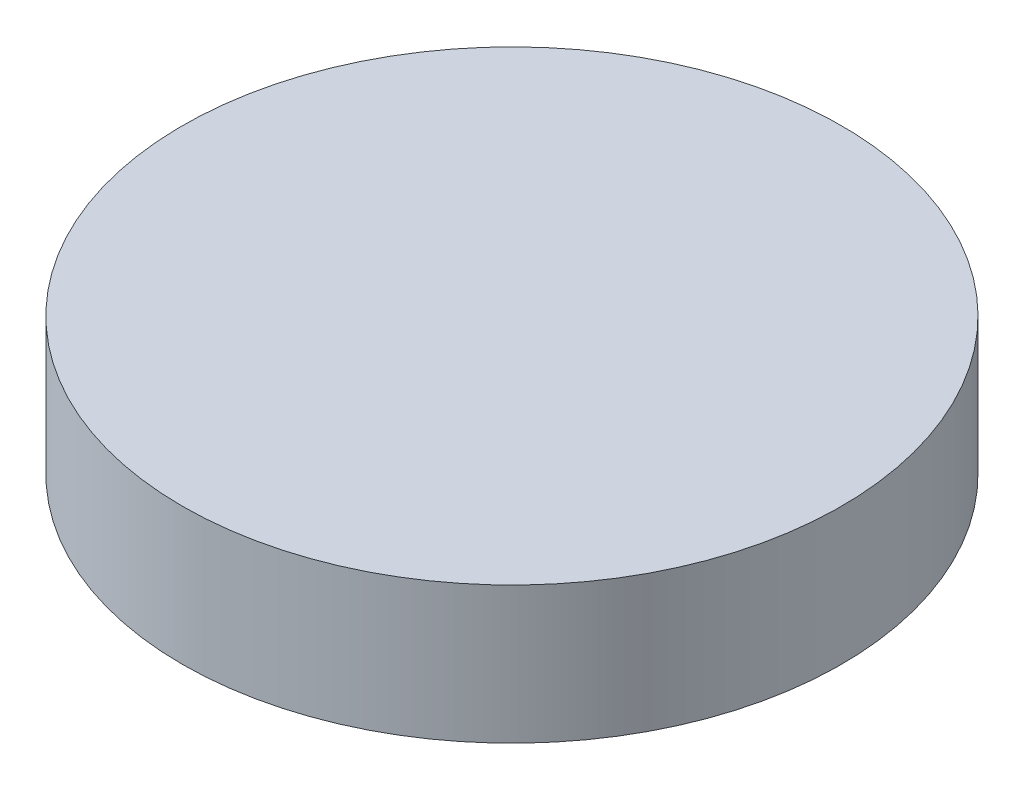
ISO-10303-21;
HEADER;
FILE_DESCRIPTION(('STEP AP214'),'2;1');
FILE_NAME('part.step','',(''),(''),'','','');
FILE_SCHEMA(('AUTOMOTIVE_DESIGN { 1 0 10303 214 1 1 1 1 }'));
ENDSEC;
DATA;
#1=APPLICATION_CONTEXT('core data for automotive mechanical design processes');
#2=APPLICATION_PROTOCOL_DEFINITION('international standard','automotive_design',2000,#1);
#3=PRODUCT_CONTEXT('',#1,'mechanical');
#4=PRODUCT('Part','Part','',(#3));
#5=PRODUCT_RELATED_PRODUCT_CATEGORY('part','',(#4));
#6=PRODUCT_DEFINITION_FORMATION('','',#4);
#7=PRODUCT_DEFINITION_CONTEXT('part definition',#1,'design');
#8=PRODUCT_DEFINITION('design','',#6,#7);
#9=PRODUCT_DEFINITION_SHAPE('','',#8);
#10=(LENGTH_UNIT() NAMED_UNIT(*) SI_UNIT(.MILLI.,.METRE.));
#11=(NAMED_UNIT(*) PLANE_ANGLE_UNIT() SI_UNIT($,.RADIAN.));
#12=(NAMED_UNIT(*) SI_UNIT($,.STERADIAN.) SOLID_ANGLE_UNIT());
#13=UNCERTAINTY_MEASURE_WITH_UNIT(LENGTH_MEASURE(1.E-05),#10,'distance_accuracy_value','');
#14=(GEOMETRIC_REPRESENTATION_CONTEXT(3) GLOBAL_UNCERTAINTY_ASSIGNED_CONTEXT((#13)) GLOBAL_UNIT_ASSIGNED_CONTEXT((#10,
#11,#12)) REPRESENTATION_CONTEXT('',''));
#15=CARTESIAN_POINT('',(0.,0.,0.));
#16=DIRECTION('',(0.,0.,1.));
#17=DIRECTION('',(1.,0.,0.));
#18=AXIS2_PLACEMENT_3D('',#15,#16,#17);
#19=CARTESIAN_POINT('',(-0.448384887306474,6.858,-0.617710745984823));
#20=DIRECTION('',(0.,-1.,0.));
#21=DIRECTION('',(0.,0.,-1.));
#22=AXIS2_PLACEMENT_3D('',#19,#20,#21);
#23=CYLINDRICAL_SURFACE('',#22,16.5);
#24=CARTESIAN_POINT('',(-0.448384887306474,6.858,-0.617710745984823));
#25=DIRECTION('',(0.,1.,0.));
#26=DIRECTION('',(0.,0.,1.));
#27=AXIS2_PLACEMENT_3D('',#24,#25,#26);
#28=CIRCLE('',#27,16.5);
#29=CARTESIAN_POINT('',(-0.448384887306474,6.858,15.8822892540152));
#30=VERTEX_POINT('',#29);
#31=EDGE_CURVE('E10',#30,#30,#28,.T.);
#32=ORIENTED_EDGE('',*,*,#31,.F.);
#33=EDGE_LOOP('',(#32));
#34=FACE_BOUND('',#33,.T.);
#35=CARTESIAN_POINT('',(-0.448384887306474,0.,-0.617710745984823));
#36=DIRECTION('',(0.,1.,0.));
#37=DIRECTION('',(0.,0.,1.));
#38=AXIS2_PLACEMENT_3D('',#35,#36,#37);
#39=CIRCLE('',#38,16.5);
#40=CARTESIAN_POINT('',(-0.448384887306474,0.,15.8822892540152));
#41=VERTEX_POINT('',#40);
#42=EDGE_CURVE('E34',#41,#41,#39,.T.);
#43=ORIENTED_EDGE('',*,*,#42,.T.);
#44=EDGE_LOOP('',(#43));
#45=FACE_BOUND('',#44,.T.);
#46=ADVANCED_FACE('F31',(#34,#45),#23,.T.);
#47=CARTESIAN_POINT('',(-0.448384887306474,6.858,-0.617710745984823));
#48=DIRECTION('',(0.,1.,0.));
#49=DIRECTION('',(0.,0.,1.));
#50=AXIS2_PLACEMENT_3D('',#47,#48,#49);
#51=PLANE('',#50);
#52=ORIENTED_EDGE('',*,*,#31,.T.);
#53=EDGE_LOOP('',(#52));
#54=FACE_BOUND('',#53,.T.);
#55=ADVANCED_FACE('F46',(#54),#51,.T.);
#56=CARTESIAN_POINT('',(-0.448384887306474,0.,-0.617710745984823));
#57=DIRECTION('',(0.,1.,0.));
#58=DIRECTION('',(0.,0.,1.));
#59=AXIS2_PLACEMENT_3D('',#56,#57,#58);
#60=PLANE('',#59);
#61=ORIENTED_EDGE('',*,*,#42,.F.);
#62=EDGE_LOOP('',(#61));
#63=FACE_BOUND('',#62,.T.);
#64=ADVANCED_FACE('F44',(#63),#60,.F.);
#65=CLOSED_SHELL('',(#46,#55,#64));
#66=MANIFOLD_SOLID_BREP('B2',#65);
#67=ADVANCED_BREP_SHAPE_REPRESENTATION('',(#18,#66),#14);
#68=SHAPE_DEFINITION_REPRESENTATION(#9,#67);
ENDSEC;
END-ISO-10303-21;
